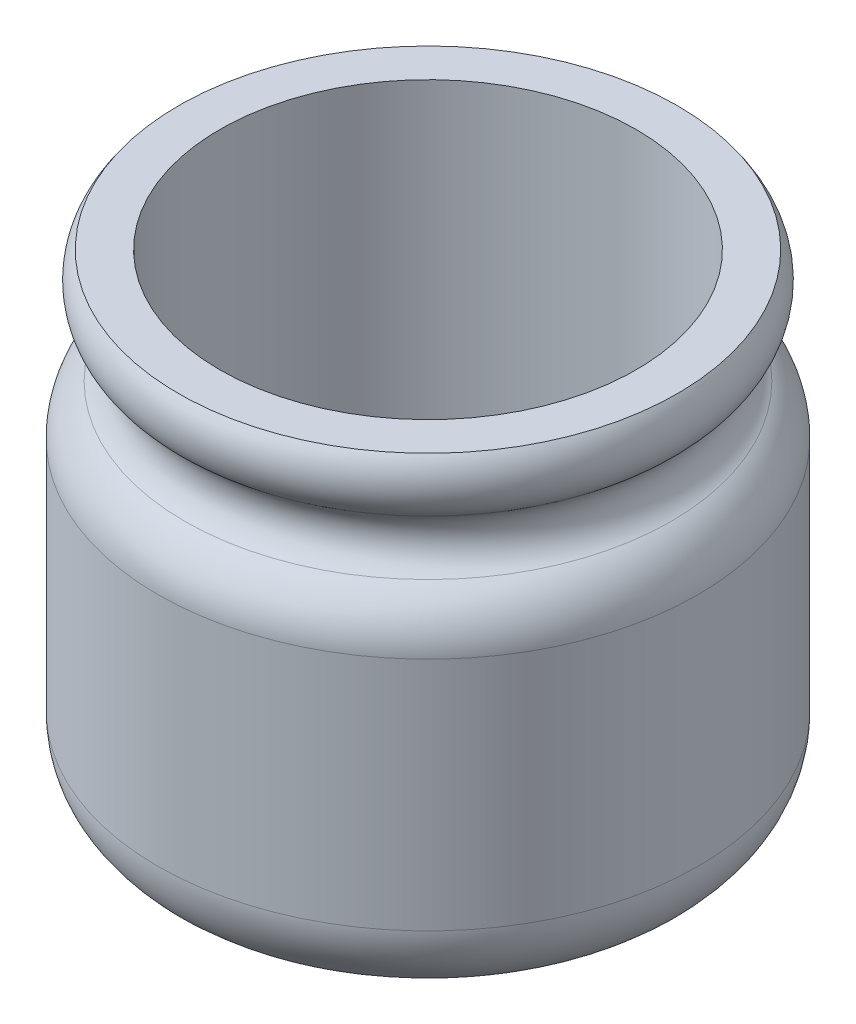
ISO-10303-21;
HEADER;
FILE_DESCRIPTION(('STEP AP214'),'2;1');
FILE_NAME('part.step','',(''),(''),'','','');
FILE_SCHEMA(('AUTOMOTIVE_DESIGN { 1 0 10303 214 1 1 1 1 }'));
ENDSEC;
DATA;
#1=APPLICATION_CONTEXT('core data for automotive mechanical design processes');
#2=APPLICATION_PROTOCOL_DEFINITION('international standard','automotive_design',2000,#1);
#3=PRODUCT_CONTEXT('',#1,'mechanical');
#4=PRODUCT('Part','Part','',(#3));
#5=PRODUCT_RELATED_PRODUCT_CATEGORY('part','',(#4));
#6=PRODUCT_DEFINITION_FORMATION('','',#4);
#7=PRODUCT_DEFINITION_CONTEXT('part definition',#1,'design');
#8=PRODUCT_DEFINITION('design','',#6,#7);
#9=PRODUCT_DEFINITION_SHAPE('','',#8);
#10=(LENGTH_UNIT() NAMED_UNIT(*) SI_UNIT(.MILLI.,.METRE.));
#11=(NAMED_UNIT(*) PLANE_ANGLE_UNIT() SI_UNIT($,.RADIAN.));
#12=(NAMED_UNIT(*) SI_UNIT($,.STERADIAN.) SOLID_ANGLE_UNIT());
#13=UNCERTAINTY_MEASURE_WITH_UNIT(LENGTH_MEASURE(1.E-05),#10,'distance_accuracy_value','');
#14=(GEOMETRIC_REPRESENTATION_CONTEXT(3) GLOBAL_UNCERTAINTY_ASSIGNED_CONTEXT((#13)) GLOBAL_UNIT_ASSIGNED_CONTEXT((#10,
#11,#12)) REPRESENTATION_CONTEXT('',''));
#15=CARTESIAN_POINT('',(0.,0.,0.));
#16=DIRECTION('',(0.,0.,1.));
#17=DIRECTION('',(1.,0.,0.));
#18=AXIS2_PLACEMENT_3D('',#15,#16,#17);
#19=CARTESIAN_POINT('',(0.,-1.26981631422366,0.));
#20=DIRECTION('',(0.,-1.,0.));
#21=DIRECTION('',(0.,0.,-1.));
#22=AXIS2_PLACEMENT_3D('',#19,#20,#21);
#23=TOROIDAL_SURFACE('',#22,10.4531799822276,2.07953111128552);
#24=CARTESIAN_POINT('',(0.,0.,0.));
#25=DIRECTION('',(0.,-1.,0.));
#26=DIRECTION('',(0.,0.,-1.));
#27=AXIS2_PLACEMENT_3D('',#24,#25,#26);
#28=CIRCLE('',#27,12.1);
#29=CARTESIAN_POINT('',(0.,0.,-12.1));
#30=VERTEX_POINT('',#29);
#31=EDGE_CURVE('E59',#30,#30,#28,.T.);
#32=ORIENTED_EDGE('',*,*,#31,.T.);
#33=EDGE_LOOP('',(#32));
#34=FACE_BOUND('',#33,.T.);
#35=CARTESIAN_POINT('',(0.,-2.85720709791836,0.));
#36=DIRECTION('',(0.,-1.,0.));
#37=DIRECTION('',(0.,0.,-1.));
#38=AXIS2_PLACEMENT_3D('',#35,#36,#37);
#39=CIRCLE('',#38,11.7965489347665);
#40=CARTESIAN_POINT('',(0.,-2.85720709791836,-11.7965489347665));
#41=VERTEX_POINT('',#40);
#42=EDGE_CURVE('E10',#41,#41,#39,.T.);
#43=ORIENTED_EDGE('',*,*,#42,.F.);
#44=EDGE_LOOP('',(#43));
#45=FACE_BOUND('',#44,.T.);
#46=ADVANCED_FACE('F31',(#34,#45),#23,.T.);
#47=CARTESIAN_POINT('',(0.,-4.18805377699302,0.));
#48=DIRECTION('',(0.,-1.,0.));
#49=DIRECTION('',(0.,0.,-1.));
#50=AXIS2_PLACEMENT_3D('',#47,#48,#49);
#51=TOROIDAL_SURFACE('',#50,12.6771937899037,1.59583465436856);
#52=ORIENTED_EDGE('',*,*,#42,.T.);
#53=EDGE_LOOP('',(#52));
#54=FACE_BOUND('',#53,.T.);
#55=CARTESIAN_POINT('',(0.,-5.51889634450492,0.));
#56=DIRECTION('',(0.,-1.,0.));
#57=DIRECTION('',(0.,0.,-1.));
#58=AXIS2_PLACEMENT_3D('',#55,#56,#57);
#59=CIRCLE('',#58,11.7965427213289);
#60=CARTESIAN_POINT('',(0.,-5.51889634450492,-11.7965427213289));
#61=VERTEX_POINT('',#60);
#62=EDGE_CURVE('E37',#61,#61,#59,.T.);
#63=ORIENTED_EDGE('',*,*,#62,.F.);
#64=EDGE_LOOP('',(#63));
#65=FACE_BOUND('',#64,.T.);
#66=ADVANCED_FACE('F77',(#54,#65),#51,.F.);
#67=CARTESIAN_POINT('',(0.,-7.94442241340019,0.));
#68=DIRECTION('',(0.,-1.,0.));
#69=DIRECTION('',(0.,0.,-1.));
#70=AXIS2_PLACEMENT_3D('',#67,#68,#69);
#71=TOROIDAL_SURFACE('',#70,10.1915128127784,2.90848718722156);
#72=ORIENTED_EDGE('',*,*,#62,.T.);
#73=EDGE_LOOP('',(#72));
#74=FACE_BOUND('',#73,.T.);
#75=CARTESIAN_POINT('',(0.,-7.94442241340019,0.));
#76=DIRECTION('',(0.,-1.,0.));
#77=DIRECTION('',(0.,0.,-1.));
#78=AXIS2_PLACEMENT_3D('',#75,#76,#77);
#79=CIRCLE('',#78,13.1);
#80=CARTESIAN_POINT('',(0.,-7.94442241340019,-13.1));
#81=VERTEX_POINT('',#80);
#82=EDGE_CURVE('E41',#81,#81,#79,.T.);
#83=ORIENTED_EDGE('',*,*,#82,.F.);
#84=EDGE_LOOP('',(#83));
#85=FACE_BOUND('',#84,.T.);
#86=ADVANCED_FACE('F81',(#74,#85),#71,.T.);
#87=CARTESIAN_POINT('',(0.,-20.2,0.));
#88=DIRECTION('',(0.,-1.,0.));
#89=DIRECTION('',(0.,0.,-1.));
#90=AXIS2_PLACEMENT_3D('',#87,#88,#89);
#91=CYLINDRICAL_SURFACE('',#90,13.1);
#92=ORIENTED_EDGE('',*,*,#82,.T.);
#93=EDGE_LOOP('',(#92));
#94=FACE_BOUND('',#93,.T.);
#95=CARTESIAN_POINT('',(0.,-19.3592608434365,0.));
#96=DIRECTION('',(0.,-1.,0.));
#97=DIRECTION('',(0.,0.,-1.));
#98=AXIS2_PLACEMENT_3D('',#95,#96,#97);
#99=CIRCLE('',#98,13.1);
#100=CARTESIAN_POINT('',(0.,-19.3592608434365,-13.1));
#101=VERTEX_POINT('',#100);
#102=EDGE_CURVE('E45',#101,#101,#99,.T.);
#103=ORIENTED_EDGE('',*,*,#102,.F.);
#104=EDGE_LOOP('',(#103));
#105=FACE_BOUND('',#104,.T.);
#106=ADVANCED_FACE('F85',(#94,#105),#91,.T.);
#107=CARTESIAN_POINT('',(0.,-19.3592608434365,0.));
#108=DIRECTION('',(0.,-1.,0.));
#109=DIRECTION('',(0.,0.,-1.));
#110=AXIS2_PLACEMENT_3D('',#107,#108,#109);
#111=TOROIDAL_SURFACE('',#110,9.25926084343654,3.84073915656347);
#112=ORIENTED_EDGE('',*,*,#102,.T.);
#113=EDGE_LOOP('',(#112));
#114=FACE_BOUND('',#113,.T.);
#115=CARTESIAN_POINT('',(0.,-23.2,0.));
#116=DIRECTION('',(0.,-1.,0.));
#117=DIRECTION('',(0.,0.,-1.));
#118=AXIS2_PLACEMENT_3D('',#115,#116,#117);
#119=CIRCLE('',#118,9.25926084343654);
#120=CARTESIAN_POINT('',(0.,-23.2,-9.25926084343653));
#121=VERTEX_POINT('',#120);
#122=EDGE_CURVE('E50',#121,#121,#119,.T.);
#123=ORIENTED_EDGE('',*,*,#122,.F.);
#124=EDGE_LOOP('',(#123));
#125=FACE_BOUND('',#124,.T.);
#126=ADVANCED_FACE('F91',(#114,#125),#111,.T.);
#127=CARTESIAN_POINT('',(0.,-23.2,-9.25926084343654));
#128=DIRECTION('',(0.,-1.,0.));
#129=DIRECTION('',(0.,0.,-1.));
#130=AXIS2_PLACEMENT_3D('',#127,#128,#129);
#131=PLANE('',#130);
#132=ORIENTED_EDGE('',*,*,#122,.T.);
#133=EDGE_LOOP('',(#132));
#134=FACE_BOUND('',#133,.T.);
#135=ADVANCED_FACE('F95',(#134),#131,.T.);
#136=CARTESIAN_POINT('',(0.,-20.2,-10.1));
#137=DIRECTION('',(0.,1.,0.));
#138=DIRECTION('',(0.,0.,1.));
#139=AXIS2_PLACEMENT_3D('',#136,#137,#138);
#140=PLANE('',#139);
#141=CARTESIAN_POINT('',(0.,-20.2,0.));
#142=DIRECTION('',(0.,-1.,0.));
#143=DIRECTION('',(0.,0.,-1.));
#144=AXIS2_PLACEMENT_3D('',#141,#142,#143);
#145=CIRCLE('',#144,10.1);
#146=CARTESIAN_POINT('',(0.,-20.2,-10.1));
#147=VERTEX_POINT('',#146);
#148=EDGE_CURVE('E53',#147,#147,#145,.T.);
#149=ORIENTED_EDGE('',*,*,#148,.F.);
#150=EDGE_LOOP('',(#149));
#151=FACE_BOUND('',#150,.T.);
#152=ADVANCED_FACE('F73',(#151),#140,.T.);
#153=CARTESIAN_POINT('',(0.,-20.2,0.));
#154=DIRECTION('',(0.,-1.,0.));
#155=DIRECTION('',(0.,0.,-1.));
#156=AXIS2_PLACEMENT_3D('',#153,#154,#155);
#157=CYLINDRICAL_SURFACE('',#156,10.1);
#158=ORIENTED_EDGE('',*,*,#148,.T.);
#159=EDGE_LOOP('',(#158));
#160=FACE_BOUND('',#159,.T.);
#161=CARTESIAN_POINT('',(0.,0.,0.));
#162=DIRECTION('',(0.,-1.,0.));
#163=DIRECTION('',(0.,0.,-1.));
#164=AXIS2_PLACEMENT_3D('',#161,#162,#163);
#165=CIRCLE('',#164,10.1);
#166=CARTESIAN_POINT('',(0.,0.,-10.1));
#167=VERTEX_POINT('',#166);
#168=EDGE_CURVE('E56',#167,#167,#165,.T.);
#169=ORIENTED_EDGE('',*,*,#168,.F.);
#170=EDGE_LOOP('',(#169));
#171=FACE_BOUND('',#170,.T.);
#172=ADVANCED_FACE('F67',(#160,#171),#157,.F.);
#173=CARTESIAN_POINT('',(0.,0.,-10.1));
#174=DIRECTION('',(0.,1.,0.));
#175=DIRECTION('',(0.,0.,1.));
#176=AXIS2_PLACEMENT_3D('',#173,#174,#175);
#177=PLANE('',#176);
#178=ORIENTED_EDGE('',*,*,#168,.T.);
#179=EDGE_LOOP('',(#178));
#180=FACE_BOUND('',#179,.T.);
#181=ORIENTED_EDGE('',*,*,#31,.F.);
#182=EDGE_LOOP('',(#181));
#183=FACE_BOUND('',#182,.T.);
#184=ADVANCED_FACE('F65',(#180,#183),#177,.T.);
#185=CLOSED_SHELL('',(#46,#66,#86,#106,#126,#135,#152,#172,#184));
#186=MANIFOLD_SOLID_BREP('B2',#185);
#187=ADVANCED_BREP_SHAPE_REPRESENTATION('',(#18,#186),#14);
#188=SHAPE_DEFINITION_REPRESENTATION(#9,#187);
ENDSEC;
END-ISO-10303-21;
